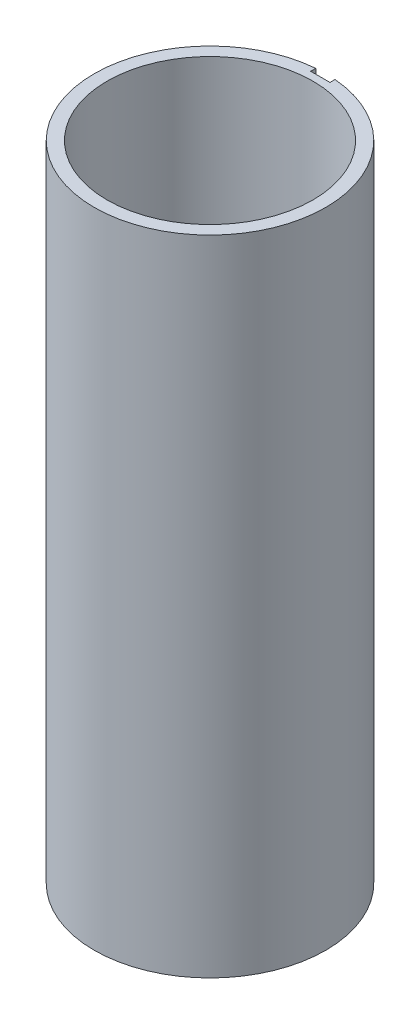
ISO-10303-21;
HEADER;
FILE_DESCRIPTION(('STEP AP214'),'2;1');
FILE_NAME('part.step','',(''),(''),'','','');
FILE_SCHEMA(('AUTOMOTIVE_DESIGN { 1 0 10303 214 1 1 1 1 }'));
ENDSEC;
DATA;
#1=APPLICATION_CONTEXT('core data for automotive mechanical design processes');
#2=APPLICATION_PROTOCOL_DEFINITION('international standard','automotive_design',2000,#1);
#3=PRODUCT_CONTEXT('',#1,'mechanical');
#4=PRODUCT('Part','Part','',(#3));
#5=PRODUCT_RELATED_PRODUCT_CATEGORY('part','',(#4));
#6=PRODUCT_DEFINITION_FORMATION('','',#4);
#7=PRODUCT_DEFINITION_CONTEXT('part definition',#1,'design');
#8=PRODUCT_DEFINITION('design','',#6,#7);
#9=PRODUCT_DEFINITION_SHAPE('','',#8);
#10=(LENGTH_UNIT() NAMED_UNIT(*) SI_UNIT(.MILLI.,.METRE.));
#11=(NAMED_UNIT(*) PLANE_ANGLE_UNIT() SI_UNIT($,.RADIAN.));
#12=(NAMED_UNIT(*) SI_UNIT($,.STERADIAN.) SOLID_ANGLE_UNIT());
#13=UNCERTAINTY_MEASURE_WITH_UNIT(LENGTH_MEASURE(1.E-05),#10,'distance_accuracy_value','');
#14=(GEOMETRIC_REPRESENTATION_CONTEXT(3) GLOBAL_UNCERTAINTY_ASSIGNED_CONTEXT((#13)) GLOBAL_UNIT_ASSIGNED_CONTEXT((#10,
#11,#12)) REPRESENTATION_CONTEXT('',''));
#15=CARTESIAN_POINT('',(0.,0.,0.));
#16=DIRECTION('',(0.,0.,1.));
#17=DIRECTION('',(1.,0.,0.));
#18=AXIS2_PLACEMENT_3D('',#15,#16,#17);
#19=CARTESIAN_POINT('',(-1.5,-0.00999999999999612,-17.15));
#20=DIRECTION('',(1.,0.,0.));
#21=DIRECTION('',(0.,0.,-1.));
#22=AXIS2_PLACEMENT_3D('',#19,#20,#21);
#23=PLANE('',#22);
#24=DIRECTION('',(0.,1.,0.));
#25=VECTOR('',#24,1.);
#26=CARTESIAN_POINT('',(-1.5,-0.00999999999999612,-17.15));
#27=LINE('',#26,#25);
#28=CARTESIAN_POINT('',(-1.5,0.,-17.15));
#29=VERTEX_POINT('',#28);
#30=CARTESIAN_POINT('',(-1.5,100.,-17.15));
#31=VERTEX_POINT('',#30);
#32=EDGE_CURVE('E11',#29,#31,#27,.T.);
#33=ORIENTED_EDGE('',*,*,#32,.F.);
#34=DIRECTION('',(0.,0.,-1.));
#35=VECTOR('',#34,1.);
#36=CARTESIAN_POINT('',(-1.5,0.,0.));
#37=LINE('',#36,#35);
#38=CARTESIAN_POINT('',(-1.5,0.,-17.9373911146521));
#39=VERTEX_POINT('',#38);
#40=EDGE_CURVE('E82',#29,#39,#37,.T.);
#41=ORIENTED_EDGE('',*,*,#40,.T.);
#42=DIRECTION('',(0.,-1.,0.));
#43=VECTOR('',#42,1.);
#44=CARTESIAN_POINT('',(-1.5,100.,-17.9373911146521));
#45=LINE('',#44,#43);
#46=CARTESIAN_POINT('',(-1.5,100.,-17.9373911146521));
#47=VERTEX_POINT('',#46);
#48=EDGE_CURVE('E43',#39,#47,#45,.F.);
#49=ORIENTED_EDGE('',*,*,#48,.T.);
#50=DIRECTION('',(0.,0.,-1.));
#51=VECTOR('',#50,1.);
#52=CARTESIAN_POINT('',(-1.5,100.,0.));
#53=LINE('',#52,#51);
#54=EDGE_CURVE('E100',#31,#47,#53,.T.);
#55=ORIENTED_EDGE('',*,*,#54,.F.);
#56=EDGE_LOOP('',(#33,#41,#49,#55));
#57=FACE_BOUND('',#56,.T.);
#58=ADVANCED_FACE('F39',(#57),#23,.T.);
#59=CARTESIAN_POINT('',(1.5,-0.00999999999999612,-20.15));
#60=DIRECTION('',(-1.,0.,0.));
#61=DIRECTION('',(0.,0.,1.));
#62=AXIS2_PLACEMENT_3D('',#59,#60,#61);
#63=PLANE('',#62);
#64=DIRECTION('',(0.,-1.,0.));
#65=VECTOR('',#64,1.);
#66=CARTESIAN_POINT('',(1.5,100.,-17.9373911146521));
#67=LINE('',#66,#65);
#68=CARTESIAN_POINT('',(1.5,0.,-17.9373911146521));
#69=VERTEX_POINT('',#68);
#70=CARTESIAN_POINT('',(1.5,100.,-17.9373911146521));
#71=VERTEX_POINT('',#70);
#72=EDGE_CURVE('E56',#69,#71,#67,.F.);
#73=ORIENTED_EDGE('',*,*,#72,.F.);
#74=DIRECTION('',(0.,0.,1.));
#75=VECTOR('',#74,1.);
#76=CARTESIAN_POINT('',(1.5,0.,0.));
#77=LINE('',#76,#75);
#78=CARTESIAN_POINT('',(1.5,0.,-17.15));
#79=VERTEX_POINT('',#78);
#80=EDGE_CURVE('E84',#69,#79,#77,.T.);
#81=ORIENTED_EDGE('',*,*,#80,.T.);
#82=DIRECTION('',(0.,1.,0.));
#83=VECTOR('',#82,1.);
#84=CARTESIAN_POINT('',(1.5,-0.00999999999999612,-17.15));
#85=LINE('',#84,#83);
#86=CARTESIAN_POINT('',(1.5,100.,-17.15));
#87=VERTEX_POINT('',#86);
#88=EDGE_CURVE('E48',#79,#87,#85,.T.);
#89=ORIENTED_EDGE('',*,*,#88,.T.);
#90=DIRECTION('',(0.,0.,1.));
#91=VECTOR('',#90,1.);
#92=CARTESIAN_POINT('',(1.5,100.,0.));
#93=LINE('',#92,#91);
#94=EDGE_CURVE('E106',#71,#87,#93,.T.);
#95=ORIENTED_EDGE('',*,*,#94,.F.);
#96=EDGE_LOOP('',(#73,#81,#89,#95));
#97=FACE_BOUND('',#96,.T.);
#98=ADVANCED_FACE('F114',(#97),#63,.T.);
#99=CARTESIAN_POINT('',(1.5,-0.00999999999999612,-17.15));
#100=DIRECTION('',(0.,0.,-1.));
#101=DIRECTION('',(-1.,0.,0.));
#102=AXIS2_PLACEMENT_3D('',#99,#100,#101);
#103=PLANE('',#102);
#104=ORIENTED_EDGE('',*,*,#88,.F.);
#105=DIRECTION('',(-1.,0.,0.));
#106=VECTOR('',#105,1.);
#107=CARTESIAN_POINT('',(0.,0.,-17.15));
#108=LINE('',#107,#106);
#109=EDGE_CURVE('E92',#79,#29,#108,.T.);
#110=ORIENTED_EDGE('',*,*,#109,.T.);
#111=ORIENTED_EDGE('',*,*,#32,.T.);
#112=DIRECTION('',(-1.,0.,0.));
#113=VECTOR('',#112,1.);
#114=CARTESIAN_POINT('',(0.,100.,-17.15));
#115=LINE('',#114,#113);
#116=EDGE_CURVE('E103',#87,#31,#115,.T.);
#117=ORIENTED_EDGE('',*,*,#116,.F.);
#118=EDGE_LOOP('',(#104,#110,#111,#117));
#119=FACE_BOUND('',#118,.T.);
#120=ADVANCED_FACE('F113',(#119),#103,.T.);
#121=CARTESIAN_POINT('',(0.,100.,0.));
#122=DIRECTION('',(0.,1.,0.));
#123=DIRECTION('',(0.,0.,1.));
#124=AXIS2_PLACEMENT_3D('',#121,#122,#123);
#125=PLANE('',#124);
#126=CARTESIAN_POINT('',(0.,100.,0.));
#127=DIRECTION('',(0.,1.,0.));
#128=DIRECTION('',(0.,0.,1.));
#129=AXIS2_PLACEMENT_3D('',#126,#127,#128);
#130=CIRCLE('',#129,16.);
#131=CARTESIAN_POINT('',(0.,100.,16.));
#132=VERTEX_POINT('',#131);
#133=EDGE_CURVE('E86',#132,#132,#130,.T.);
#134=ORIENTED_EDGE('',*,*,#133,.F.);
#135=EDGE_LOOP('',(#134));
#136=FACE_BOUND('',#135,.T.);
#137=CARTESIAN_POINT('',(0.,100.,0.));
#138=DIRECTION('',(0.,1.,0.));
#139=DIRECTION('',(0.,0.,1.));
#140=AXIS2_PLACEMENT_3D('',#137,#138,#139);
#141=CIRCLE('',#140,18.);
#142=EDGE_CURVE('E87',#47,#71,#141,.T.);
#143=ORIENTED_EDGE('',*,*,#142,.T.);
#144=ORIENTED_EDGE('',*,*,#94,.T.);
#145=ORIENTED_EDGE('',*,*,#116,.T.);
#146=ORIENTED_EDGE('',*,*,#54,.T.);
#147=EDGE_LOOP('',(#143,#144,#145,#146));
#148=FACE_BOUND('',#147,.T.);
#149=ADVANCED_FACE('F101',(#136,#148),#125,.T.);
#150=CARTESIAN_POINT('',(0.,0.,0.));
#151=DIRECTION('',(0.,1.,0.));
#152=DIRECTION('',(0.,0.,1.));
#153=AXIS2_PLACEMENT_3D('',#150,#151,#152);
#154=PLANE('',#153);
#155=CARTESIAN_POINT('',(0.,0.,0.));
#156=DIRECTION('',(0.,1.,0.));
#157=DIRECTION('',(0.,0.,1.));
#158=AXIS2_PLACEMENT_3D('',#155,#156,#157);
#159=CIRCLE('',#158,16.);
#160=CARTESIAN_POINT('',(0.,0.,16.));
#161=VERTEX_POINT('',#160);
#162=EDGE_CURVE('E115',#161,#161,#159,.T.);
#163=ORIENTED_EDGE('',*,*,#162,.T.);
#164=EDGE_LOOP('',(#163));
#165=FACE_BOUND('',#164,.T.);
#166=ORIENTED_EDGE('',*,*,#80,.F.);
#167=CARTESIAN_POINT('',(0.,0.,0.));
#168=DIRECTION('',(0.,1.,0.));
#169=DIRECTION('',(0.,0.,1.));
#170=AXIS2_PLACEMENT_3D('',#167,#168,#169);
#171=CIRCLE('',#170,18.);
#172=EDGE_CURVE('E79',#39,#69,#171,.T.);
#173=ORIENTED_EDGE('',*,*,#172,.F.);
#174=ORIENTED_EDGE('',*,*,#40,.F.);
#175=ORIENTED_EDGE('',*,*,#109,.F.);
#176=EDGE_LOOP('',(#166,#173,#174,#175));
#177=FACE_BOUND('',#176,.T.);
#178=ADVANCED_FACE('F41',(#165,#177),#154,.F.);
#179=CARTESIAN_POINT('',(0.,100.,0.));
#180=DIRECTION('',(0.,-1.,0.));
#181=DIRECTION('',(0.,0.,-1.));
#182=AXIS2_PLACEMENT_3D('',#179,#180,#181);
#183=CYLINDRICAL_SURFACE('',#182,18.);
#184=ORIENTED_EDGE('',*,*,#48,.F.);
#185=ORIENTED_EDGE('',*,*,#172,.T.);
#186=ORIENTED_EDGE('',*,*,#72,.T.);
#187=ORIENTED_EDGE('',*,*,#142,.F.);
#188=EDGE_LOOP('',(#184,#185,#186,#187));
#189=FACE_BOUND('',#188,.T.);
#190=ADVANCED_FACE('F93',(#189),#183,.T.);
#191=CARTESIAN_POINT('',(0.,100.,0.));
#192=DIRECTION('',(0.,-1.,0.));
#193=DIRECTION('',(0.,0.,-1.));
#194=AXIS2_PLACEMENT_3D('',#191,#192,#193);
#195=CYLINDRICAL_SURFACE('',#194,16.);
#196=ORIENTED_EDGE('',*,*,#133,.T.);
#197=EDGE_LOOP('',(#196));
#198=FACE_BOUND('',#197,.T.);
#199=ORIENTED_EDGE('',*,*,#162,.F.);
#200=EDGE_LOOP('',(#199));
#201=FACE_BOUND('',#200,.T.);
#202=ADVANCED_FACE('F122',(#198,#201),#195,.F.);
#203=CLOSED_SHELL('',(#58,#98,#120,#149,#178,#190,#202));
#204=MANIFOLD_SOLID_BREP('B2',#203);
#205=ADVANCED_BREP_SHAPE_REPRESENTATION('',(#18,#204),#14);
#206=SHAPE_DEFINITION_REPRESENTATION(#9,#205);
ENDSEC;
END-ISO-10303-21;
